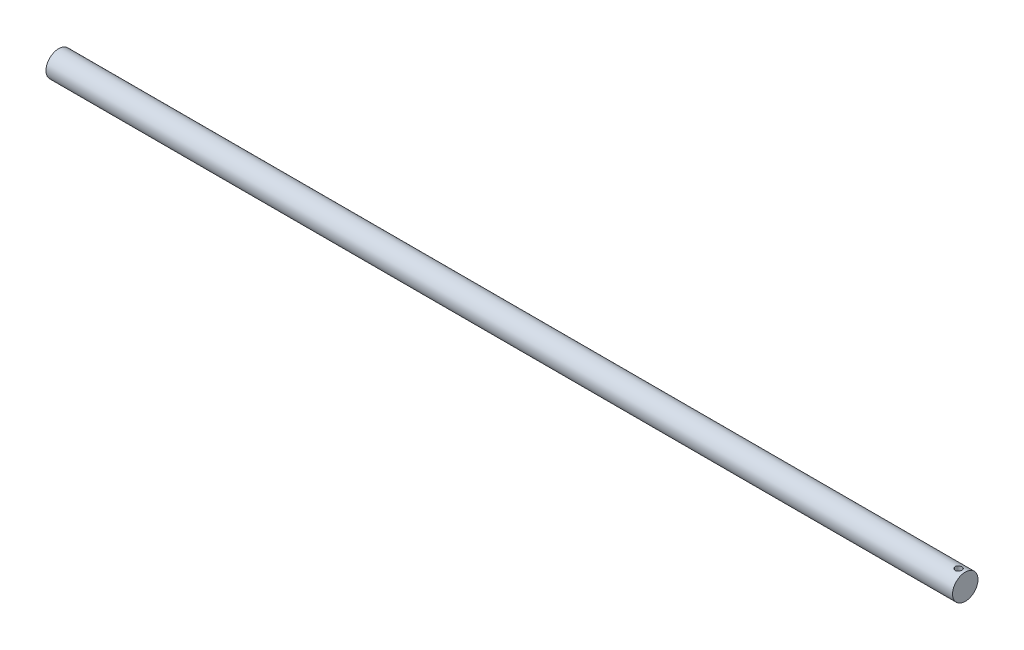
ISO-10303-21;
HEADER;
FILE_DESCRIPTION(('STEP AP214'),'2;1');
FILE_NAME('part.step','',(''),(''),'','','');
FILE_SCHEMA(('AUTOMOTIVE_DESIGN { 1 0 10303 214 1 1 1 1 }'));
ENDSEC;
DATA;
#1=APPLICATION_CONTEXT('core data for automotive mechanical design processes');
#2=APPLICATION_PROTOCOL_DEFINITION('international standard','automotive_design',2000,#1);
#3=PRODUCT_CONTEXT('',#1,'mechanical');
#4=PRODUCT('Part','Part','',(#3));
#5=PRODUCT_RELATED_PRODUCT_CATEGORY('part','',(#4));
#6=PRODUCT_DEFINITION_FORMATION('','',#4);
#7=PRODUCT_DEFINITION_CONTEXT('part definition',#1,'design');
#8=PRODUCT_DEFINITION('design','',#6,#7);
#9=PRODUCT_DEFINITION_SHAPE('','',#8);
#10=(LENGTH_UNIT() NAMED_UNIT(*) SI_UNIT(.MILLI.,.METRE.));
#11=(NAMED_UNIT(*) PLANE_ANGLE_UNIT() SI_UNIT($,.RADIAN.));
#12=(NAMED_UNIT(*) SI_UNIT($,.STERADIAN.) SOLID_ANGLE_UNIT());
#13=UNCERTAINTY_MEASURE_WITH_UNIT(LENGTH_MEASURE(1.E-05),#10,'distance_accuracy_value','');
#14=(GEOMETRIC_REPRESENTATION_CONTEXT(3) GLOBAL_UNCERTAINTY_ASSIGNED_CONTEXT((#13)) GLOBAL_UNIT_ASSIGNED_CONTEXT((#10,
#11,#12)) REPRESENTATION_CONTEXT('',''));
#15=CARTESIAN_POINT('',(0.,0.,0.));
#16=DIRECTION('',(0.,0.,1.));
#17=DIRECTION('',(1.,0.,0.));
#18=AXIS2_PLACEMENT_3D('',#15,#16,#17);
#19=CARTESIAN_POINT('',(432.491693866125,-6.17633735811104E-08,-8.40545373986505E-08));
#20=DIRECTION('',(-1.,0.,0.));
#21=DIRECTION('',(0.,0.,1.));
#22=AXIS2_PLACEMENT_3D('',#19,#20,#21);
#23=CYLINDRICAL_SURFACE('',#22,7.275);
#24=CARTESIAN_POINT('',(426.866693866125,-7.27500006176337,-8.40545373986505E-08));
#25=CARTESIAN_POINT('',(426.866696573572,-7.27499838963638,0.103489328252539));
#26=CARTESIAN_POINT('',(426.875290693482,-7.27276992368321,0.20700840302909));
#27=CARTESIAN_POINT('',(426.909384354562,-7.26409628336906,0.411072726365277));
#28=CARTESIAN_POINT('',(426.93489281572,-7.25764888412473,0.511616376556368));
#29=CARTESIAN_POINT('',(427.001937007715,-7.24125026603813,0.706754094899846));
#30=CARTESIAN_POINT('',(427.043452841137,-7.23130339842879,0.801355380404375));
#31=CARTESIAN_POINT('',(427.141261565274,-7.20896146338622,0.982251552230425));
#32=CARTESIAN_POINT('',(427.197555179075,-7.19656627616289,1.06854603181346));
#33=CARTESIAN_POINT('',(427.324616475337,-7.17036809095555,1.23225873561514));
#34=CARTESIAN_POINT('',(427.395645825483,-7.15654229155795,1.30947023222584));
#35=CARTESIAN_POINT('',(427.5496024999,-7.12919028268435,1.45102744457231));
#36=CARTESIAN_POINT('',(427.632531249363,-7.11566410931895,1.51537161697364));
#37=CARTESIAN_POINT('',(427.809558341834,-7.09021144166165,1.63035620250729));
#38=CARTESIAN_POINT('',(427.903813366116,-7.07831381370356,1.68076236680178));
#39=CARTESIAN_POINT('',(428.099815904907,-7.05779911058367,1.76493259062508));
#40=CARTESIAN_POINT('',(428.20156213495,-7.04918147457992,1.79869949557233));
#41=CARTESIAN_POINT('',(428.407378166829,-7.03643731370366,1.84792162920237));
#42=CARTESIAN_POINT('',(428.51135293999,-7.03221942544713,1.86374999125691));
#43=CARTESIAN_POINT('',(428.720561069814,-7.02847908152411,1.8778084688365));
#44=CARTESIAN_POINT('',(428.825794204784,-7.02895581060884,1.87604163987264));
#45=CARTESIAN_POINT('',(429.031648267904,-7.03446887036038,1.85525692052868));
#46=CARTESIAN_POINT('',(429.132318072586,-7.03938685223388,1.83668677314998));
#47=CARTESIAN_POINT('',(429.329062787655,-7.05303927177163,1.78353811278987));
#48=CARTESIAN_POINT('',(429.425137351843,-7.06177399648316,1.7489583957588));
#49=CARTESIAN_POINT('',(429.611149661274,-7.0821822555669,1.66439829282482));
#50=CARTESIAN_POINT('',(429.701011225114,-7.09388607307649,1.61425794227501));
#51=CARTESIAN_POINT('',(429.871204217581,-7.11889707146076,1.50011161679564));
#52=CARTESIAN_POINT('',(429.951533878536,-7.13220454881135,1.4361030762399));
#53=CARTESIAN_POINT('',(430.102945173806,-7.15941917161932,1.29373172585223));
#54=CARTESIAN_POINT('',(430.1736717141,-7.17333225294451,1.21499191026529));
#55=CARTESIAN_POINT('',(430.300986236224,-7.19982679680812,1.04660082983628));
#56=CARTESIAN_POINT('',(430.357573731078,-7.21240821347285,0.956949189327892));
#57=CARTESIAN_POINT('',(430.455146005724,-7.23489101738577,0.768752976255241));
#58=CARTESIAN_POINT('',(430.49607010764,-7.24478194008727,0.670175613106403));
#59=CARTESIAN_POINT('',(430.560665181132,-7.26069345195818,0.467227947684453));
#60=CARTESIAN_POINT('',(430.584339666741,-7.26671482938843,0.362858829952329));
#61=CARTESIAN_POINT('',(430.613214227106,-7.2740909849933,0.154323759812153));
#62=CARTESIAN_POINT('',(430.618897503476,-7.27556778864475,0.0502289297330049));
#63=CARTESIAN_POINT('',(430.612957777534,-7.27403744856927,-0.157425349073342));
#64=CARTESIAN_POINT('',(430.601336437849,-7.27103073561852,-0.260984848275843));
#65=CARTESIAN_POINT('',(430.561514803558,-7.26094968708321,-0.462928911611715));
#66=CARTESIAN_POINT('',(430.53358081403,-7.25394072829018,-0.561369549857492));
#67=CARTESIAN_POINT('',(430.46223331393,-7.23664734700615,-0.752160524788466));
#68=CARTESIAN_POINT('',(430.418818185474,-7.22636258218284,-0.844510223732787));
#69=CARTESIAN_POINT('',(430.316822754307,-7.20336901364756,-1.02239987055123));
#70=CARTESIAN_POINT('',(430.257975357374,-7.19061867462003,-1.1077811760876));
#71=CARTESIAN_POINT('',(430.127124660318,-7.16416929798061,-1.26762754927905));
#72=CARTESIAN_POINT('',(430.055118939704,-7.15047008611077,-1.34209060395845));
#73=CARTESIAN_POINT('',(429.89774654614,-7.12322321755947,-1.47999865136865));
#74=CARTESIAN_POINT('',(429.812079174016,-7.10968894164393,-1.54310374778348));
#75=CARTESIAN_POINT('',(429.631088431586,-7.08470222752595,-1.65404559548012));
#76=CARTESIAN_POINT('',(429.535765481491,-7.07324969878615,-1.70188301083773));
#77=CARTESIAN_POINT('',(429.338667476057,-7.0538522615924,-1.78057227089576));
#78=CARTESIAN_POINT('',(429.23693450512,-7.04588674626789,-1.81152417753615));
#79=CARTESIAN_POINT('',(429.029470046292,-7.03435184763066,-1.85581626162331));
#80=CARTESIAN_POINT('',(428.923739505199,-7.03078143000809,-1.86916058276248));
#81=CARTESIAN_POINT('',(428.714749431526,-7.02852330649337,-1.87763207885168));
#82=CARTESIAN_POINT('',(428.611513209636,-7.0296896241745,-1.87330386256996));
#83=CARTESIAN_POINT('',(428.407296072064,-7.03643410098478,-1.84780727718725));
#84=CARTESIAN_POINT('',(428.306315105469,-7.04201216041471,-1.82663928864157));
#85=CARTESIAN_POINT('',(428.110109663663,-7.0568676955276,-1.76836998482721));
#86=CARTESIAN_POINT('',(428.014851017462,-7.06612001846845,-1.73137687260151));
#87=CARTESIAN_POINT('',(427.831822301404,-7.08728372669332,-1.64259216467948));
#88=CARTESIAN_POINT('',(427.744053336114,-7.09919550325577,-1.59079839108645));
#89=CARTESIAN_POINT('',(427.575878307726,-7.1247469912897,-1.47220122104377));
#90=CARTESIAN_POINT('',(427.495742563832,-7.13842534125545,-1.40502277041003));
#91=CARTESIAN_POINT('',(427.347704455804,-7.16574504692586,-1.25828606078388));
#92=CARTESIAN_POINT('',(427.279805030629,-7.17938639296996,-1.1787248361856));
#93=CARTESIAN_POINT('',(427.156865490308,-7.20541418345913,-1.00760064552292));
#94=CARTESIAN_POINT('',(427.102103238742,-7.21777082171293,-0.915833160199384));
#95=CARTESIAN_POINT('',(427.008870052203,-7.23951740134606,-0.724081900449104));
#96=CARTESIAN_POINT('',(426.970387995277,-7.24890936694966,-0.62410379111724));
#97=CARTESIAN_POINT('',(426.916205289204,-7.26235882653373,-0.436991420564137));
#98=CARTESIAN_POINT('',(426.897679983967,-7.26706583149994,-0.350710978281746));
#99=CARTESIAN_POINT('',(426.872923644274,-7.27338702924116,-0.176294120800785));
#100=CARTESIAN_POINT('',(426.866691559777,-7.27500148617,-0.0881578647690656));
#101=CARTESIAN_POINT('',(426.866693866125,-7.27500006176337,-8.40545373986505E-08));
#102=B_SPLINE_CURVE_WITH_KNOTS('',3,(#24,#25,#26,#27,#28,#29,#30,#31,#32,#33,#34,#35,#36,#37,
#38,#39,#40,#41,#42,#43,#44,#45,#46,#47,#48,#49,#50,#51,#52,#53,#54,#55,#56,#57,#58,#59,#60,#61,
#62,#63,#64,#65,#66,#67,#68,#69,#70,#71,#72,#73,#74,#75,#76,#77,#78,#79,#80,#81,#82,#83,#84,#85,
#86,#87,#88,#89,#90,#91,#92,#93,#94,#95,#96,#97,#98,#99,#100,#101),.UNSPECIFIED.,.T.,.F.,(4,2,2,
2,2,2,2,2,2,2,2,2,2,2,2,2,2,2,2,2,2,2,2,2,2,2,2,2,2,2,2,2,2,2,2,2,2,2,4),(0.,0.310145066200979,
0.620453821481758,0.930378095142166,1.2403175363746,1.55632172879936,1.8723638007411,
2.19343279199968,2.51444685936256,2.82865348807035,3.14280555385296,3.44882551367833,
3.75486849242956,4.06416810835226,4.37352499388299,4.69228012322275,5.01104622959496,
5.33103498723553,5.65095853963508,5.96221343182278,6.27343842057323,6.57971930789535,
6.88603221306616,7.19804348500611,7.51011220969162,7.83035940792538,8.15059267494008,
8.46890706601044,8.78714653299129,9.09565410542674,9.40415470622038,9.71057885079087,
10.0170481084861,10.3319820477548,10.6469915283535,10.9681698537714,11.2891284077723,
11.5533490256617,11.8175470738129),.UNSPECIFIED.);
#103=CARTESIAN_POINT('',(426.866693866125,-7.27500006176337,-8.40545373986505E-08));
#104=VERTEX_POINT('',#103);
#105=EDGE_CURVE('E10',#104,#104,#102,.T.);
#106=ORIENTED_EDGE('',*,*,#105,.T.);
#107=EDGE_LOOP('',(#106));
#108=FACE_BOUND('',#107,.T.);
#109=CARTESIAN_POINT('',(428.741693866125,7.02922464655263,1.8749999159454));
#110=CARTESIAN_POINT('',(428.638268834432,7.02922654882684,1.87499717270376));
#111=CARTESIAN_POINT('',(428.534814067589,7.03153221386371,1.86641337425877));
#112=CARTESIAN_POINT('',(428.330883128799,7.04048036780523,1.8323644197811));
#113=CARTESIAN_POINT('',(428.230408611771,7.04712522079295,1.80689006129132));
#114=CARTESIAN_POINT('',(428.035417546701,7.06395031255979,1.73994551983431));
#115=CARTESIAN_POINT('',(427.940893192914,7.07412580044207,1.69849682401402));
#116=CARTESIAN_POINT('',(427.760127435558,7.09685966252319,1.60084650437317));
#117=CARTESIAN_POINT('',(427.673886518524,7.10941817656247,1.54464401469815));
#118=CARTESIAN_POINT('',(427.510119732836,7.13583185308157,1.41767744866084));
#119=CARTESIAN_POINT('',(427.432816108687,7.14970878128838,1.34663118255486));
#120=CARTESIAN_POINT('',(427.291079273749,7.17700732845421,1.19260120496814));
#121=CARTESIAN_POINT('',(427.226647324876,7.19042890266413,1.10961632441648));
#122=CARTESIAN_POINT('',(427.111565572195,7.21554625398302,0.93253374541047));
#123=CARTESIAN_POINT('',(427.061135293529,7.22721335504477,0.838288962827701));
#124=CARTESIAN_POINT('',(426.976917736139,7.24725822918155,0.642308312220399));
#125=CARTESIAN_POINT('',(426.943127842405,7.25563651904598,0.54057362411281));
#126=CARTESIAN_POINT('',(426.893865473663,7.26800587961558,0.334819283029433));
#127=CARTESIAN_POINT('',(426.878015292541,7.27208728351224,0.23089558670544));
#128=CARTESIAN_POINT('',(426.863895431635,7.2757182763992,0.021789423200836));
#129=CARTESIAN_POINT('',(426.865622995988,7.27526857578229,-0.083392844076613));
#130=CARTESIAN_POINT('',(426.886340520204,7.26995479032245,-0.289406528587522));
#131=CARTESIAN_POINT('',(426.904922610742,7.26519501127606,-0.390282060660795));
#132=CARTESIAN_POINT('',(426.958164591958,7.25191807430004,-0.58743180581798));
#133=CARTESIAN_POINT('',(426.992825367527,7.24340070957299,-0.683705765332709));
#134=CARTESIAN_POINT('',(427.077562847452,7.22340827214346,-0.869978815807323));
#135=CARTESIAN_POINT('',(427.127782227885,7.2119059925106,-0.95990996193369));
#136=CARTESIAN_POINT('',(427.242102571273,7.1871876234534,-1.13020969729402));
#137=CARTESIAN_POINT('',(427.306206083501,7.17397121947682,-1.2105765262143));
#138=CARTESIAN_POINT('',(427.448651852929,7.14681325569354,-1.36189982521325));
#139=CARTESIAN_POINT('',(427.527350235464,7.13286177101426,-1.43251965560233));
#140=CARTESIAN_POINT('',(427.695618209403,7.10615125099825,-1.55963770176841));
#141=CARTESIAN_POINT('',(427.785188376352,7.09339227885583,-1.61613516943043));
#142=CARTESIAN_POINT('',(427.973349356962,7.07047385750725,-1.7136386810072));
#143=CARTESIAN_POINT('',(428.071986515696,7.06032890124448,-1.75455893280581));
#144=CARTESIAN_POINT('',(428.275065893028,7.04397024862512,-1.8191286915952));
#145=CARTESIAN_POINT('',(428.379506774266,7.03775565064368,-1.84278215978125));
#146=CARTESIAN_POINT('',(428.588094880197,7.03015190560541,-1.87157846312222));
#147=CARTESIAN_POINT('',(428.692168442655,7.02863251577471,-1.87722106086739));
#148=CARTESIAN_POINT('',(428.899771027496,7.03023586187278,-1.87120764739156));
#149=CARTESIAN_POINT('',(429.003300102529,7.03335814036468,-1.85955334078242));
#150=CARTESIAN_POINT('',(429.204987442734,7.04376775673984,-1.81971624783909));
#151=CARTESIAN_POINT('',(429.303208241699,7.05098063198687,-1.79182872734221));
#152=CARTESIAN_POINT('',(429.493579783497,7.06868709963424,-1.72064630492192));
#153=CARTESIAN_POINT('',(429.58572977138,7.07918109913801,-1.67734949100795));
#154=CARTESIAN_POINT('',(429.763449272554,7.10253847257843,-1.5755458813953));
#155=CARTESIAN_POINT('',(429.848843028276,7.11544640648853,-1.51674271853757));
#156=CARTESIAN_POINT('',(430.008734549955,7.14206999364264,-1.38596697283813));
#157=CARTESIAN_POINT('',(430.083230403673,7.1557857880499,-1.31399208374909));
#158=CARTESIAN_POINT('',(430.221258752229,7.1829242653316,-1.15661413366078));
#159=CARTESIAN_POINT('',(430.284444243286,7.1963292635911,-1.07090309780582));
#160=CARTESIAN_POINT('',(430.395527439176,7.22095707580937,-0.889798743051649));
#161=CARTESIAN_POINT('',(430.443425951955,7.23218000508249,-0.794405936204312));
#162=CARTESIAN_POINT('',(430.52214779507,7.25110746316545,-0.597313035633839));
#163=CARTESIAN_POINT('',(430.553096411022,7.25883773149266,-0.495665572689601));
#164=CARTESIAN_POINT('',(430.597410670039,7.27002184981197,-0.288385412477918));
#165=CARTESIAN_POINT('',(430.610779934777,7.27347658063536,-0.182753540686887));
#166=CARTESIAN_POINT('',(430.619341624119,7.27568183511281,0.0262453861646312));
#167=CARTESIAN_POINT('',(430.615044708034,7.27456452288331,0.129590434393567));
#168=CARTESIAN_POINT('',(430.589572985565,7.26804696311522,0.334033787280974));
#169=CARTESIAN_POINT('',(430.568398739906,7.26264685786588,0.435132166466872));
#170=CARTESIAN_POINT('',(430.51005426195,7.24819359320766,0.63164133268335));
#171=CARTESIAN_POINT('',(430.472981540744,7.23916272336025,0.72708281829871));
#172=CARTESIAN_POINT('',(430.383980157683,7.21839577513583,0.910445241043321));
#173=CARTESIAN_POINT('',(430.332049523216,7.20665933759427,0.99836517755916));
#174=CARTESIAN_POINT('',(430.21327773516,7.18137278698074,1.16659029113859));
#175=CARTESIAN_POINT('',(430.146093679143,7.16778440893485,1.2466476109186));
#176=CARTESIAN_POINT('',(429.999380868695,7.14048951506331,1.39452502628355));
#177=CARTESIAN_POINT('',(429.919848937259,7.1267829696938,1.46234196278197));
#178=CARTESIAN_POINT('',(429.74876861646,7.10048744454435,1.58516094876618));
#179=CARTESIAN_POINT('',(429.657010325452,7.08792656058549,1.63987713406677));
#180=CARTESIAN_POINT('',(429.465285521394,7.06573078747664,1.73302652260975));
#181=CARTESIAN_POINT('',(429.365324766186,7.05609386775487,1.77147103321661));
#182=CARTESIAN_POINT('',(429.178303327479,7.04226713288214,1.82557562689287));
#183=CARTESIAN_POINT('',(429.092100372893,7.03741425015823,1.8440679355842));
#184=CARTESIAN_POINT('',(428.917836635139,7.0308923524243,1.86878064901378));
#185=CARTESIAN_POINT('',(428.829776034257,7.02922302647639,1.8750022522335));
#186=CARTESIAN_POINT('',(428.741693866125,7.02922464655263,1.8749999159454));
#187=B_SPLINE_CURVE_WITH_KNOTS('',3,(#109,#110,#111,#112,#113,#114,#115,#116,#117,#118,#119,
#120,#121,#122,#123,#124,#125,#126,#127,#128,#129,#130,#131,#132,#133,#134,#135,#136,#137,#138,
#139,#140,#141,#142,#143,#144,#145,#146,#147,#148,#149,#150,#151,#152,#153,#154,#155,#156,#157,
#158,#159,#160,#161,#162,#163,#164,#165,#166,#167,#168,#169,#170,#171,#172,#173,#174,#175,#176,
#177,#178,#179,#180,#181,#182,#183,#184,#185,#186),.UNSPECIFIED.,.T.,.F.,(4,2,2,2,2,2,2,2,2,2,2,
2,2,2,2,2,2,2,2,2,2,2,2,2,2,2,2,2,2,2,2,2,2,2,2,2,2,2,4),(0.,0.309951438387031,
0.620071886041038,0.929776637151615,1.23949956793955,1.5557566915125,1.87204480519587,
2.19304292551581,2.51399058538578,2.82804736669828,3.14205491052287,3.44866066425625,
3.75528329403512,4.06480539475492,4.37438437523839,4.69285632977846,5.01134515140924,
5.33156352283848,5.65170840944865,5.96288906814396,6.27403906198677,6.57969895579618,
6.88539678922334,7.19742422619658,7.50950634864725,7.82994559115981,8.15036789502559,
8.46838867636066,8.78634392925507,9.09517393710355,9.4039936849775,9.71094582695481,
10.0179387403684,10.3326712560231,10.6474848843299,10.9686442144069,11.2895799994711,
11.5535766467607,11.817547508185),.UNSPECIFIED.);
#188=CARTESIAN_POINT('',(428.741693866125,7.02922464655263,1.8749999159454));
#189=VERTEX_POINT('',#188);
#190=EDGE_CURVE('E43',#189,#189,#187,.T.);
#191=ORIENTED_EDGE('',*,*,#190,.T.);
#192=EDGE_LOOP('',(#191));
#193=FACE_BOUND('',#192,.T.);
#194=CARTESIAN_POINT('',(432.491693866125,-6.17633735811104E-08,-8.40545373986505E-08));
#195=DIRECTION('',(1.,0.,0.));
#196=DIRECTION('',(0.,0.,-1.));
#197=AXIS2_PLACEMENT_3D('',#194,#195,#196);
#198=CIRCLE('',#197,7.275);
#199=CARTESIAN_POINT('',(432.491693866125,-6.17633735811104E-08,-7.27500008405454));
#200=VERTEX_POINT('',#199);
#201=EDGE_CURVE('E47',#200,#200,#198,.T.);
#202=ORIENTED_EDGE('',*,*,#201,.F.);
#203=EDGE_LOOP('',(#202));
#204=FACE_BOUND('',#203,.T.);
#205=CARTESIAN_POINT('',(-86.3091076338752,-6.17633735811104E-08,-8.40545373986505E-08));
#206=DIRECTION('',(1.,0.,0.));
#207=DIRECTION('',(0.,0.,-1.));
#208=AXIS2_PLACEMENT_3D('',#205,#206,#207);
#209=CIRCLE('',#208,7.275);
#210=CARTESIAN_POINT('',(-86.3091076338752,-6.17633735811104E-08,-7.27500008405454));
#211=VERTEX_POINT('',#210);
#212=EDGE_CURVE('E51',#211,#211,#209,.T.);
#213=ORIENTED_EDGE('',*,*,#212,.T.);
#214=EDGE_LOOP('',(#213));
#215=FACE_BOUND('',#214,.T.);
#216=ADVANCED_FACE('F32',(#108,#193,#204,#215),#23,.T.);
#217=CARTESIAN_POINT('',(432.491693866125,-6.17633735811104E-08,-8.40545373986505E-08));
#218=DIRECTION('',(1.,0.,0.));
#219=DIRECTION('',(0.,0.,-1.));
#220=AXIS2_PLACEMENT_3D('',#217,#218,#219);
#221=PLANE('',#220);
#222=ORIENTED_EDGE('',*,*,#201,.T.);
#223=EDGE_LOOP('',(#222));
#224=FACE_BOUND('',#223,.T.);
#225=ADVANCED_FACE('F63',(#224),#221,.T.);
#226=CARTESIAN_POINT('',(-86.3091076338752,-6.17633735811104E-08,-8.40545373986505E-08));
#227=DIRECTION('',(1.,0.,0.));
#228=DIRECTION('',(0.,0.,-1.));
#229=AXIS2_PLACEMENT_3D('',#226,#227,#228);
#230=PLANE('',#229);
#231=ORIENTED_EDGE('',*,*,#212,.F.);
#232=EDGE_LOOP('',(#231));
#233=FACE_BOUND('',#232,.T.);
#234=ADVANCED_FACE('F61',(#233),#230,.F.);
#235=CARTESIAN_POINT('',(428.741693866125,-7.27500006176337,-8.40545373986505E-08));
#236=DIRECTION('',(0.,1.,0.));
#237=DIRECTION('',(0.,0.,1.));
#238=AXIS2_PLACEMENT_3D('',#235,#236,#237);
#239=CYLINDRICAL_SURFACE('',#238,1.87499999999993);
#240=ORIENTED_EDGE('',*,*,#190,.F.);
#241=EDGE_LOOP('',(#240));
#242=FACE_BOUND('',#241,.T.);
#243=ORIENTED_EDGE('',*,*,#105,.F.);
#244=EDGE_LOOP('',(#243));
#245=FACE_BOUND('',#244,.T.);
#246=ADVANCED_FACE('F57',(#242,#245),#239,.F.);
#247=CLOSED_SHELL('',(#216,#225,#234,#246));
#248=MANIFOLD_SOLID_BREP('B2',#247);
#249=ADVANCED_BREP_SHAPE_REPRESENTATION('',(#18,#248),#14);
#250=SHAPE_DEFINITION_REPRESENTATION(#9,#249);
ENDSEC;
END-ISO-10303-21;
